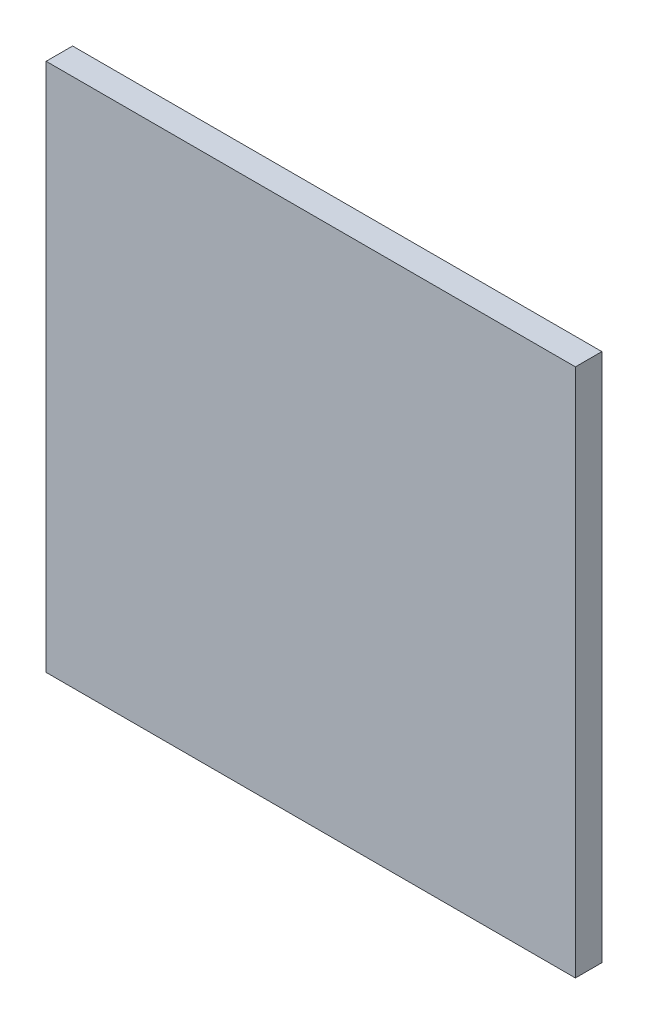
ISO-10303-21;
HEADER;
FILE_DESCRIPTION(('STEP AP214'),'2;1');
FILE_NAME('part.step','',(''),(''),'','','');
FILE_SCHEMA(('AUTOMOTIVE_DESIGN { 1 0 10303 214 1 1 1 1 }'));
ENDSEC;
DATA;
#1=APPLICATION_CONTEXT('core data for automotive mechanical design processes');
#2=APPLICATION_PROTOCOL_DEFINITION('international standard','automotive_design',2000,#1);
#3=PRODUCT_CONTEXT('',#1,'mechanical');
#4=PRODUCT('Part','Part','',(#3));
#5=PRODUCT_RELATED_PRODUCT_CATEGORY('part','',(#4));
#6=PRODUCT_DEFINITION_FORMATION('','',#4);
#7=PRODUCT_DEFINITION_CONTEXT('part definition',#1,'design');
#8=PRODUCT_DEFINITION('design','',#6,#7);
#9=PRODUCT_DEFINITION_SHAPE('','',#8);
#10=(LENGTH_UNIT() NAMED_UNIT(*) SI_UNIT(.MILLI.,.METRE.));
#11=(NAMED_UNIT(*) PLANE_ANGLE_UNIT() SI_UNIT($,.RADIAN.));
#12=(NAMED_UNIT(*) SI_UNIT($,.STERADIAN.) SOLID_ANGLE_UNIT());
#13=UNCERTAINTY_MEASURE_WITH_UNIT(LENGTH_MEASURE(1.E-05),#10,'distance_accuracy_value','');
#14=(GEOMETRIC_REPRESENTATION_CONTEXT(3) GLOBAL_UNCERTAINTY_ASSIGNED_CONTEXT((#13)) GLOBAL_UNIT_ASSIGNED_CONTEXT((#10,
#11,#12)) REPRESENTATION_CONTEXT('',''));
#15=CARTESIAN_POINT('',(0.,0.,0.));
#16=DIRECTION('',(0.,0.,1.));
#17=DIRECTION('',(1.,0.,0.));
#18=AXIS2_PLACEMENT_3D('',#15,#16,#17);
#19=CARTESIAN_POINT('',(50.,-50.,5.));
#20=DIRECTION('',(-1.,0.,0.));
#21=DIRECTION('',(0.,0.,1.));
#22=AXIS2_PLACEMENT_3D('',#19,#20,#21);
#23=PLANE('',#22);
#24=DIRECTION('',(0.,1.,0.));
#25=VECTOR('',#24,1.);
#26=CARTESIAN_POINT('',(50.,-50.,0.));
#27=LINE('',#26,#25);
#28=CARTESIAN_POINT('',(50.,-50.,0.));
#29=VERTEX_POINT('',#28);
#30=CARTESIAN_POINT('',(50.,50.,0.));
#31=VERTEX_POINT('',#30);
#32=EDGE_CURVE('E96',#29,#31,#27,.T.);
#33=ORIENTED_EDGE('',*,*,#32,.T.);
#34=DIRECTION('',(0.,0.,-1.));
#35=VECTOR('',#34,1.);
#36=CARTESIAN_POINT('',(50.,50.,5.));
#37=LINE('',#36,#35);
#38=CARTESIAN_POINT('',(50.,50.,5.));
#39=VERTEX_POINT('',#38);
#40=EDGE_CURVE('E11',#39,#31,#37,.T.);
#41=ORIENTED_EDGE('',*,*,#40,.F.);
#42=DIRECTION('',(0.,1.,0.));
#43=VECTOR('',#42,1.);
#44=CARTESIAN_POINT('',(50.,-50.,5.));
#45=LINE('',#44,#43);
#46=CARTESIAN_POINT('',(50.,-50.,5.));
#47=VERTEX_POINT('',#46);
#48=EDGE_CURVE('E84',#47,#39,#45,.T.);
#49=ORIENTED_EDGE('',*,*,#48,.F.);
#50=DIRECTION('',(0.,0.,-1.));
#51=VECTOR('',#50,1.);
#52=CARTESIAN_POINT('',(50.,-50.,5.));
#53=LINE('',#52,#51);
#54=EDGE_CURVE('E92',#47,#29,#53,.T.);
#55=ORIENTED_EDGE('',*,*,#54,.T.);
#56=EDGE_LOOP('',(#33,#41,#49,#55));
#57=FACE_BOUND('',#56,.T.);
#58=ADVANCED_FACE('F33',(#57),#23,.F.);
#59=CARTESIAN_POINT('',(-50.,50.,5.));
#60=DIRECTION('',(0.,-1.,0.));
#61=DIRECTION('',(0.,0.,-1.));
#62=AXIS2_PLACEMENT_3D('',#59,#60,#61);
#63=PLANE('',#62);
#64=DIRECTION('',(-1.,0.,0.));
#65=VECTOR('',#64,1.);
#66=CARTESIAN_POINT('',(-50.,50.,0.));
#67=LINE('',#66,#65);
#68=CARTESIAN_POINT('',(-50.,50.,0.));
#69=VERTEX_POINT('',#68);
#70=EDGE_CURVE('E88',#31,#69,#67,.T.);
#71=ORIENTED_EDGE('',*,*,#70,.T.);
#72=DIRECTION('',(0.,0.,-1.));
#73=VECTOR('',#72,1.);
#74=CARTESIAN_POINT('',(-50.,50.,5.));
#75=LINE('',#74,#73);
#76=CARTESIAN_POINT('',(-50.,50.,5.));
#77=VERTEX_POINT('',#76);
#78=EDGE_CURVE('E41',#77,#69,#75,.T.);
#79=ORIENTED_EDGE('',*,*,#78,.F.);
#80=DIRECTION('',(-1.,0.,0.));
#81=VECTOR('',#80,1.);
#82=CARTESIAN_POINT('',(-50.,50.,5.));
#83=LINE('',#82,#81);
#84=EDGE_CURVE('E79',#39,#77,#83,.T.);
#85=ORIENTED_EDGE('',*,*,#84,.F.);
#86=ORIENTED_EDGE('',*,*,#40,.T.);
#87=EDGE_LOOP('',(#71,#79,#85,#86));
#88=FACE_BOUND('',#87,.T.);
#89=ADVANCED_FACE('F87',(#88),#63,.F.);
#90=CARTESIAN_POINT('',(-50.,-50.,5.));
#91=DIRECTION('',(1.,0.,0.));
#92=DIRECTION('',(0.,0.,-1.));
#93=AXIS2_PLACEMENT_3D('',#90,#91,#92);
#94=PLANE('',#93);
#95=DIRECTION('',(0.,-1.,0.));
#96=VECTOR('',#95,1.);
#97=CARTESIAN_POINT('',(-50.,-50.,0.));
#98=LINE('',#97,#96);
#99=CARTESIAN_POINT('',(-50.,-50.,0.));
#100=VERTEX_POINT('',#99);
#101=EDGE_CURVE('E66',#69,#100,#98,.T.);
#102=ORIENTED_EDGE('',*,*,#101,.T.);
#103=DIRECTION('',(0.,0.,-1.));
#104=VECTOR('',#103,1.);
#105=CARTESIAN_POINT('',(-50.,-50.,5.));
#106=LINE('',#105,#104);
#107=CARTESIAN_POINT('',(-50.,-50.,5.));
#108=VERTEX_POINT('',#107);
#109=EDGE_CURVE('E89',#108,#100,#106,.T.);
#110=ORIENTED_EDGE('',*,*,#109,.F.);
#111=DIRECTION('',(0.,-1.,0.));
#112=VECTOR('',#111,1.);
#113=CARTESIAN_POINT('',(-50.,-50.,5.));
#114=LINE('',#113,#112);
#115=EDGE_CURVE('E82',#77,#108,#114,.T.);
#116=ORIENTED_EDGE('',*,*,#115,.F.);
#117=ORIENTED_EDGE('',*,*,#78,.T.);
#118=EDGE_LOOP('',(#102,#110,#116,#117));
#119=FACE_BOUND('',#118,.T.);
#120=ADVANCED_FACE('F90',(#119),#94,.F.);
#121=CARTESIAN_POINT('',(-50.,-50.,5.));
#122=DIRECTION('',(0.,1.,0.));
#123=DIRECTION('',(0.,0.,1.));
#124=AXIS2_PLACEMENT_3D('',#121,#122,#123);
#125=PLANE('',#124);
#126=DIRECTION('',(1.,0.,0.));
#127=VECTOR('',#126,1.);
#128=CARTESIAN_POINT('',(-50.,-50.,0.));
#129=LINE('',#128,#127);
#130=EDGE_CURVE('E72',#100,#29,#129,.T.);
#131=ORIENTED_EDGE('',*,*,#130,.T.);
#132=ORIENTED_EDGE('',*,*,#54,.F.);
#133=DIRECTION('',(1.,0.,0.));
#134=VECTOR('',#133,1.);
#135=CARTESIAN_POINT('',(-50.,-50.,5.));
#136=LINE('',#135,#134);
#137=EDGE_CURVE('E49',#108,#47,#136,.T.);
#138=ORIENTED_EDGE('',*,*,#137,.F.);
#139=ORIENTED_EDGE('',*,*,#109,.T.);
#140=EDGE_LOOP('',(#131,#132,#138,#139));
#141=FACE_BOUND('',#140,.T.);
#142=ADVANCED_FACE('F103',(#141),#125,.F.);
#143=CARTESIAN_POINT('',(0.,0.,5.));
#144=DIRECTION('',(0.,0.,-1.));
#145=DIRECTION('',(-1.,0.,0.));
#146=AXIS2_PLACEMENT_3D('',#143,#144,#145);
#147=PLANE('',#146);
#148=ORIENTED_EDGE('',*,*,#48,.T.);
#149=ORIENTED_EDGE('',*,*,#84,.T.);
#150=ORIENTED_EDGE('',*,*,#115,.T.);
#151=ORIENTED_EDGE('',*,*,#137,.T.);
#152=EDGE_LOOP('',(#148,#149,#150,#151));
#153=FACE_BOUND('',#152,.T.);
#154=ADVANCED_FACE('F80',(#153),#147,.F.);
#155=CARTESIAN_POINT('',(0.,0.,0.));
#156=DIRECTION('',(0.,0.,-1.));
#157=DIRECTION('',(-1.,0.,0.));
#158=AXIS2_PLACEMENT_3D('',#155,#156,#157);
#159=PLANE('',#158);
#160=ORIENTED_EDGE('',*,*,#32,.F.);
#161=ORIENTED_EDGE('',*,*,#130,.F.);
#162=ORIENTED_EDGE('',*,*,#101,.F.);
#163=ORIENTED_EDGE('',*,*,#70,.F.);
#164=EDGE_LOOP('',(#160,#161,#162,#163));
#165=FACE_BOUND('',#164,.T.);
#166=ADVANCED_FACE('F106',(#165),#159,.T.);
#167=CLOSED_SHELL('',(#58,#89,#120,#142,#154,#166));
#168=MANIFOLD_SOLID_BREP('B2',#167);
#169=ADVANCED_BREP_SHAPE_REPRESENTATION('',(#18,#168),#14);
#170=SHAPE_DEFINITION_REPRESENTATION(#9,#169);
ENDSEC;
END-ISO-10303-21;
